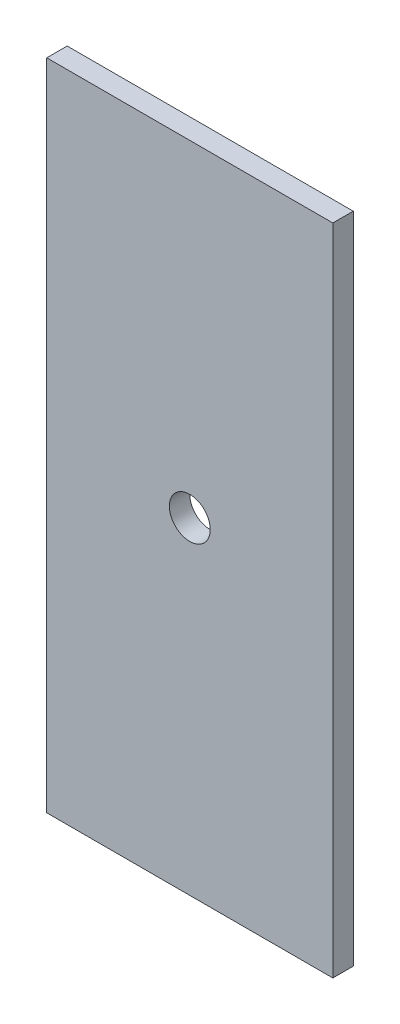
ISO-10303-21;
HEADER;
FILE_DESCRIPTION(('STEP AP214'),'2;1');
FILE_NAME('part.step','',(''),(''),'','','');
FILE_SCHEMA(('AUTOMOTIVE_DESIGN { 1 0 10303 214 1 1 1 1 }'));
ENDSEC;
DATA;
#1=APPLICATION_CONTEXT('core data for automotive mechanical design processes');
#2=APPLICATION_PROTOCOL_DEFINITION('international standard','automotive_design',2000,#1);
#3=PRODUCT_CONTEXT('',#1,'mechanical');
#4=PRODUCT('Part','Part','',(#3));
#5=PRODUCT_RELATED_PRODUCT_CATEGORY('part','',(#4));
#6=PRODUCT_DEFINITION_FORMATION('','',#4);
#7=PRODUCT_DEFINITION_CONTEXT('part definition',#1,'design');
#8=PRODUCT_DEFINITION('design','',#6,#7);
#9=PRODUCT_DEFINITION_SHAPE('','',#8);
#10=(LENGTH_UNIT() NAMED_UNIT(*) SI_UNIT(.MILLI.,.METRE.));
#11=(NAMED_UNIT(*) PLANE_ANGLE_UNIT() SI_UNIT($,.RADIAN.));
#12=(NAMED_UNIT(*) SI_UNIT($,.STERADIAN.) SOLID_ANGLE_UNIT());
#13=UNCERTAINTY_MEASURE_WITH_UNIT(LENGTH_MEASURE(1.E-05),#10,'distance_accuracy_value','');
#14=(GEOMETRIC_REPRESENTATION_CONTEXT(3) GLOBAL_UNCERTAINTY_ASSIGNED_CONTEXT((#13)) GLOBAL_UNIT_ASSIGNED_CONTEXT((#10,
#11,#12)) REPRESENTATION_CONTEXT('',''));
#15=CARTESIAN_POINT('',(0.,0.,0.));
#16=DIRECTION('',(0.,0.,1.));
#17=DIRECTION('',(1.,0.,0.));
#18=AXIS2_PLACEMENT_3D('',#15,#16,#17);
#19=CARTESIAN_POINT('',(-44.45,-101.6,3.175));
#20=DIRECTION('',(-1.,0.,0.));
#21=DIRECTION('',(0.,0.,1.));
#22=AXIS2_PLACEMENT_3D('',#19,#20,#21);
#23=PLANE('',#22);
#24=DIRECTION('',(0.,1.,0.));
#25=VECTOR('',#24,1.);
#26=CARTESIAN_POINT('',(-44.45,-101.6,-3.175));
#27=LINE('',#26,#25);
#28=CARTESIAN_POINT('',(-44.45,-101.6,-3.175));
#29=VERTEX_POINT('',#28);
#30=CARTESIAN_POINT('',(-44.45,101.6,-3.175));
#31=VERTEX_POINT('',#30);
#32=EDGE_CURVE('E119',#29,#31,#27,.T.);
#33=ORIENTED_EDGE('',*,*,#32,.F.);
#34=DIRECTION('',(0.,0.,-1.));
#35=VECTOR('',#34,1.);
#36=CARTESIAN_POINT('',(-44.45,-101.6,3.175));
#37=LINE('',#36,#35);
#38=CARTESIAN_POINT('',(-44.45,-101.6,3.175));
#39=VERTEX_POINT('',#38);
#40=EDGE_CURVE('E11',#39,#29,#37,.T.);
#41=ORIENTED_EDGE('',*,*,#40,.F.);
#42=DIRECTION('',(0.,1.,0.));
#43=VECTOR('',#42,1.);
#44=CARTESIAN_POINT('',(-44.45,-101.6,3.175));
#45=LINE('',#44,#43);
#46=CARTESIAN_POINT('',(-44.45,101.6,3.175));
#47=VERTEX_POINT('',#46);
#48=EDGE_CURVE('E109',#39,#47,#45,.T.);
#49=ORIENTED_EDGE('',*,*,#48,.T.);
#50=DIRECTION('',(0.,0.,-1.));
#51=VECTOR('',#50,1.);
#52=CARTESIAN_POINT('',(-44.45,101.6,3.175));
#53=LINE('',#52,#51);
#54=EDGE_CURVE('E48',#47,#31,#53,.T.);
#55=ORIENTED_EDGE('',*,*,#54,.T.);
#56=EDGE_LOOP('',(#33,#41,#49,#55));
#57=FACE_BOUND('',#56,.T.);
#58=ADVANCED_FACE('F45',(#57),#23,.T.);
#59=CARTESIAN_POINT('',(-44.45,-101.6,3.175));
#60=DIRECTION('',(0.,1.,0.));
#61=DIRECTION('',(0.,0.,1.));
#62=AXIS2_PLACEMENT_3D('',#59,#60,#61);
#63=PLANE('',#62);
#64=DIRECTION('',(1.,0.,0.));
#65=VECTOR('',#64,1.);
#66=CARTESIAN_POINT('',(-44.45,-101.6,-3.175));
#67=LINE('',#66,#65);
#68=CARTESIAN_POINT('',(44.45,-101.6,-3.175));
#69=VERTEX_POINT('',#68);
#70=EDGE_CURVE('E79',#29,#69,#67,.T.);
#71=ORIENTED_EDGE('',*,*,#70,.T.);
#72=DIRECTION('',(0.,0.,-1.));
#73=VECTOR('',#72,1.);
#74=CARTESIAN_POINT('',(44.45,-101.6,3.175));
#75=LINE('',#74,#73);
#76=CARTESIAN_POINT('',(44.45,-101.6,3.175));
#77=VERTEX_POINT('',#76);
#78=EDGE_CURVE('E55',#77,#69,#75,.T.);
#79=ORIENTED_EDGE('',*,*,#78,.F.);
#80=DIRECTION('',(1.,0.,0.));
#81=VECTOR('',#80,1.);
#82=CARTESIAN_POINT('',(-44.45,-101.6,3.175));
#83=LINE('',#82,#81);
#84=EDGE_CURVE('E96',#39,#77,#83,.T.);
#85=ORIENTED_EDGE('',*,*,#84,.F.);
#86=ORIENTED_EDGE('',*,*,#40,.T.);
#87=EDGE_LOOP('',(#71,#79,#85,#86));
#88=FACE_BOUND('',#87,.T.);
#89=ADVANCED_FACE('F179',(#88),#63,.F.);
#90=CARTESIAN_POINT('',(44.45,-101.6,3.175));
#91=DIRECTION('',(-1.,0.,0.));
#92=DIRECTION('',(0.,0.,1.));
#93=AXIS2_PLACEMENT_3D('',#90,#91,#92);
#94=PLANE('',#93);
#95=DIRECTION('',(0.,1.,0.));
#96=VECTOR('',#95,1.);
#97=CARTESIAN_POINT('',(44.45,-101.6,-3.175));
#98=LINE('',#97,#96);
#99=CARTESIAN_POINT('',(44.45,101.6,-3.175));
#100=VERTEX_POINT('',#99);
#101=EDGE_CURVE('E104',#69,#100,#98,.T.);
#102=ORIENTED_EDGE('',*,*,#101,.T.);
#103=DIRECTION('',(0.,0.,-1.));
#104=VECTOR('',#103,1.);
#105=CARTESIAN_POINT('',(44.45,101.6,3.175));
#106=LINE('',#105,#104);
#107=CARTESIAN_POINT('',(44.45,101.6,3.175));
#108=VERTEX_POINT('',#107);
#109=EDGE_CURVE('E101',#108,#100,#106,.T.);
#110=ORIENTED_EDGE('',*,*,#109,.F.);
#111=DIRECTION('',(0.,1.,0.));
#112=VECTOR('',#111,1.);
#113=CARTESIAN_POINT('',(44.45,-101.6,3.175));
#114=LINE('',#113,#112);
#115=EDGE_CURVE('E91',#77,#108,#114,.T.);
#116=ORIENTED_EDGE('',*,*,#115,.F.);
#117=ORIENTED_EDGE('',*,*,#78,.T.);
#118=EDGE_LOOP('',(#102,#110,#116,#117));
#119=FACE_BOUND('',#118,.T.);
#120=ADVANCED_FACE('F102',(#119),#94,.F.);
#121=CARTESIAN_POINT('',(-44.45,101.6,3.175));
#122=DIRECTION('',(0.,1.,0.));
#123=DIRECTION('',(0.,0.,1.));
#124=AXIS2_PLACEMENT_3D('',#121,#122,#123);
#125=PLANE('',#124);
#126=DIRECTION('',(1.,0.,0.));
#127=VECTOR('',#126,1.);
#128=CARTESIAN_POINT('',(-44.45,101.6,-3.175));
#129=LINE('',#128,#127);
#130=EDGE_CURVE('E123',#31,#100,#129,.T.);
#131=ORIENTED_EDGE('',*,*,#130,.F.);
#132=ORIENTED_EDGE('',*,*,#54,.F.);
#133=DIRECTION('',(1.,0.,0.));
#134=VECTOR('',#133,1.);
#135=CARTESIAN_POINT('',(-44.45,101.6,3.175));
#136=LINE('',#135,#134);
#137=EDGE_CURVE('E95',#47,#108,#136,.T.);
#138=ORIENTED_EDGE('',*,*,#137,.T.);
#139=ORIENTED_EDGE('',*,*,#109,.T.);
#140=EDGE_LOOP('',(#131,#132,#138,#139));
#141=FACE_BOUND('',#140,.T.);
#142=ADVANCED_FACE('F107',(#141),#125,.T.);
#143=CARTESIAN_POINT('',(0.,0.,3.175));
#144=DIRECTION('',(0.,0.,-1.));
#145=DIRECTION('',(-1.,0.,0.));
#146=AXIS2_PLACEMENT_3D('',#143,#144,#145);
#147=PLANE('',#146);
#148=CARTESIAN_POINT('',(0.,0.,3.175));
#149=DIRECTION('',(0.,0.,1.));
#150=DIRECTION('',(1.,0.,0.));
#151=AXIS2_PLACEMENT_3D('',#148,#149,#150);
#152=CIRCLE('',#151,6.35);
#153=CARTESIAN_POINT('',(6.35000000000001,0.,3.175));
#154=VERTEX_POINT('',#153);
#155=EDGE_CURVE('E159',#154,#154,#152,.T.);
#156=ORIENTED_EDGE('',*,*,#155,.F.);
#157=EDGE_LOOP('',(#156));
#158=FACE_BOUND('',#157,.T.);
#159=ORIENTED_EDGE('',*,*,#48,.F.);
#160=ORIENTED_EDGE('',*,*,#84,.T.);
#161=ORIENTED_EDGE('',*,*,#115,.T.);
#162=ORIENTED_EDGE('',*,*,#137,.F.);
#163=EDGE_LOOP('',(#159,#160,#161,#162));
#164=FACE_BOUND('',#163,.T.);
#165=ADVANCED_FACE('F94',(#158,#164),#147,.F.);
#166=CARTESIAN_POINT('',(0.,0.,-3.175));
#167=DIRECTION('',(0.,0.,-1.));
#168=DIRECTION('',(-1.,0.,0.));
#169=AXIS2_PLACEMENT_3D('',#166,#167,#168);
#170=PLANE('',#169);
#171=CARTESIAN_POINT('',(0.,0.,-3.175));
#172=DIRECTION('',(0.,0.,1.));
#173=DIRECTION('',(1.,0.,0.));
#174=AXIS2_PLACEMENT_3D('',#171,#172,#173);
#175=CIRCLE('',#174,6.35);
#176=CARTESIAN_POINT('',(6.35,0.,-3.175));
#177=VERTEX_POINT('',#176);
#178=EDGE_CURVE('E124',#177,#177,#175,.T.);
#179=ORIENTED_EDGE('',*,*,#178,.T.);
#180=EDGE_LOOP('',(#179));
#181=FACE_BOUND('',#180,.T.);
#182=ORIENTED_EDGE('',*,*,#32,.T.);
#183=ORIENTED_EDGE('',*,*,#130,.T.);
#184=ORIENTED_EDGE('',*,*,#101,.F.);
#185=ORIENTED_EDGE('',*,*,#70,.F.);
#186=EDGE_LOOP('',(#182,#183,#184,#185));
#187=FACE_BOUND('',#186,.T.);
#188=ADVANCED_FACE('F135',(#181,#187),#170,.T.);
#189=CARTESIAN_POINT('',(0.,0.,3.175));
#190=DIRECTION('',(0.,0.,1.));
#191=DIRECTION('',(1.,0.,0.));
#192=AXIS2_PLACEMENT_3D('',#189,#190,#191);
#193=CYLINDRICAL_SURFACE('',#192,6.35);
#194=ORIENTED_EDGE('',*,*,#178,.F.);
#195=EDGE_LOOP('',(#194));
#196=FACE_BOUND('',#195,.T.);
#197=ORIENTED_EDGE('',*,*,#155,.T.);
#198=EDGE_LOOP('',(#197));
#199=FACE_BOUND('',#198,.T.);
#200=ADVANCED_FACE('F167',(#196,#199),#193,.F.);
#201=CLOSED_SHELL('',(#58,#89,#120,#142,#165,#188,#200));
#202=MANIFOLD_SOLID_BREP('B2',#201);
#203=ADVANCED_BREP_SHAPE_REPRESENTATION('',(#18,#202),#14);
#204=SHAPE_DEFINITION_REPRESENTATION(#9,#203);
ENDSEC;
END-ISO-10303-21;
